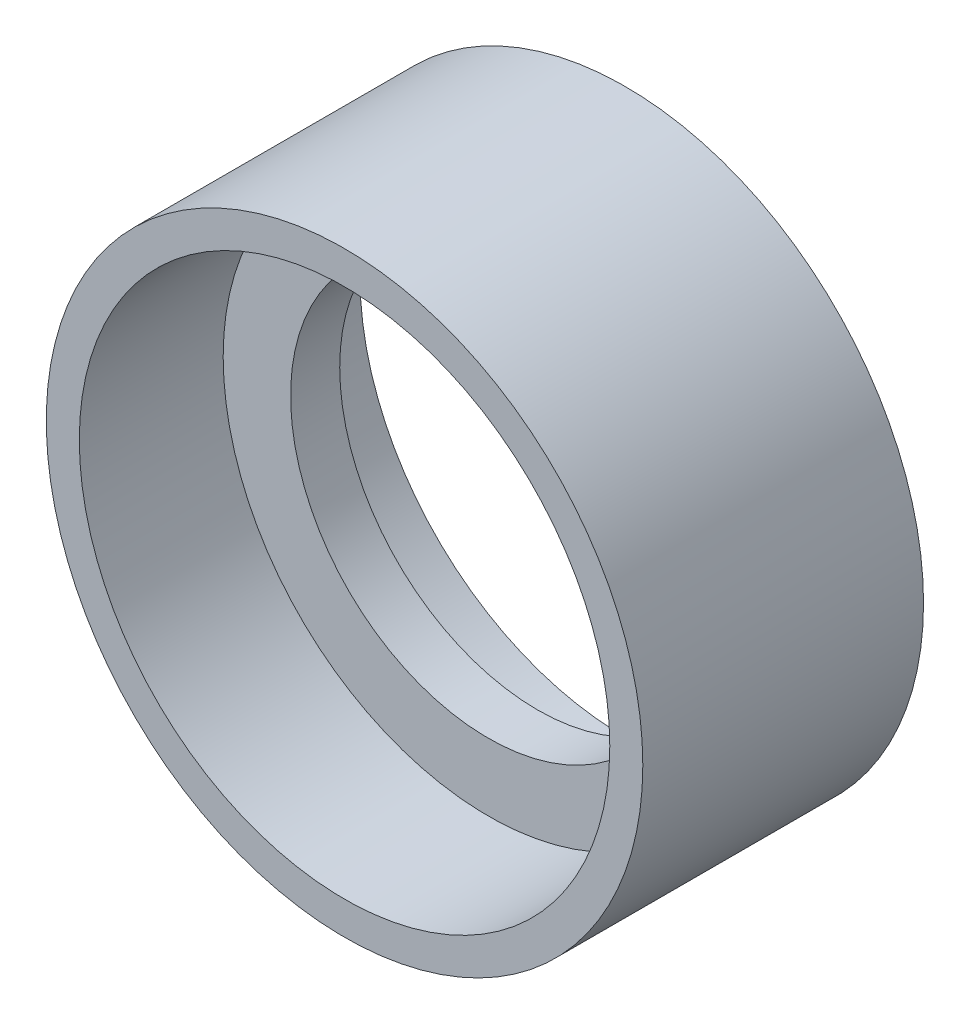
ISO-10303-21;
HEADER;
FILE_DESCRIPTION(('STEP AP214'),'2;1');
FILE_NAME('part.step','',(''),(''),'','','');
FILE_SCHEMA(('AUTOMOTIVE_DESIGN { 1 0 10303 214 1 1 1 1 }'));
ENDSEC;
DATA;
#1=APPLICATION_CONTEXT('core data for automotive mechanical design processes');
#2=APPLICATION_PROTOCOL_DEFINITION('international standard','automotive_design',2000,#1);
#3=PRODUCT_CONTEXT('',#1,'mechanical');
#4=PRODUCT('Part','Part','',(#3));
#5=PRODUCT_RELATED_PRODUCT_CATEGORY('part','',(#4));
#6=PRODUCT_DEFINITION_FORMATION('','',#4);
#7=PRODUCT_DEFINITION_CONTEXT('part definition',#1,'design');
#8=PRODUCT_DEFINITION('design','',#6,#7);
#9=PRODUCT_DEFINITION_SHAPE('','',#8);
#10=(LENGTH_UNIT() NAMED_UNIT(*) SI_UNIT(.MILLI.,.METRE.));
#11=(NAMED_UNIT(*) PLANE_ANGLE_UNIT() SI_UNIT($,.RADIAN.));
#12=(NAMED_UNIT(*) SI_UNIT($,.STERADIAN.) SOLID_ANGLE_UNIT());
#13=UNCERTAINTY_MEASURE_WITH_UNIT(LENGTH_MEASURE(1.E-05),#10,'distance_accuracy_value','');
#14=(GEOMETRIC_REPRESENTATION_CONTEXT(3) GLOBAL_UNCERTAINTY_ASSIGNED_CONTEXT((#13)) GLOBAL_UNIT_ASSIGNED_CONTEXT((#10,
#11,#12)) REPRESENTATION_CONTEXT('',''));
#15=CARTESIAN_POINT('',(0.,0.,0.));
#16=DIRECTION('',(0.,0.,1.));
#17=DIRECTION('',(1.,0.,0.));
#18=AXIS2_PLACEMENT_3D('',#15,#16,#17);
#19=CARTESIAN_POINT('',(0.,0.,12.7));
#20=DIRECTION('',(0.,0.,-1.));
#21=DIRECTION('',(-1.,0.,0.));
#22=AXIS2_PLACEMENT_3D('',#19,#20,#21);
#23=CYLINDRICAL_SURFACE('',#22,12.);
#24=CARTESIAN_POINT('',(0.,0.,12.7));
#25=DIRECTION('',(0.,0.,-1.));
#26=DIRECTION('',(-1.,0.,0.));
#27=AXIS2_PLACEMENT_3D('',#24,#25,#26);
#28=CIRCLE('',#27,12.);
#29=CARTESIAN_POINT('',(-12.,0.,12.7));
#30=VERTEX_POINT('',#29);
#31=EDGE_CURVE('E51',#30,#30,#28,.T.);
#32=ORIENTED_EDGE('',*,*,#31,.F.);
#33=EDGE_LOOP('',(#32));
#34=FACE_BOUND('',#33,.T.);
#35=CARTESIAN_POINT('',(0.,0.,6.19125));
#36=DIRECTION('',(0.,0.,-1.));
#37=DIRECTION('',(-1.,0.,0.));
#38=AXIS2_PLACEMENT_3D('',#35,#36,#37);
#39=CIRCLE('',#38,12.);
#40=CARTESIAN_POINT('',(-12.,0.,6.19125));
#41=VERTEX_POINT('',#40);
#42=EDGE_CURVE('E10',#41,#41,#39,.F.);
#43=ORIENTED_EDGE('',*,*,#42,.F.);
#44=EDGE_LOOP('',(#43));
#45=FACE_BOUND('',#44,.T.);
#46=ADVANCED_FACE('F35',(#34,#45),#23,.F.);
#47=CARTESIAN_POINT('',(0.,0.,12.7));
#48=DIRECTION('',(0.,0.,-1.));
#49=DIRECTION('',(-1.,0.,0.));
#50=AXIS2_PLACEMENT_3D('',#47,#48,#49);
#51=CYLINDRICAL_SURFACE('',#50,13.49375);
#52=CARTESIAN_POINT('',(0.,0.,12.7));
#53=DIRECTION('',(0.,0.,1.));
#54=DIRECTION('',(1.,0.,0.));
#55=AXIS2_PLACEMENT_3D('',#52,#53,#54);
#56=CIRCLE('',#55,13.49375);
#57=CARTESIAN_POINT('',(13.49375,0.,12.7));
#58=VERTEX_POINT('',#57);
#59=EDGE_CURVE('E43',#58,#58,#56,.T.);
#60=ORIENTED_EDGE('',*,*,#59,.F.);
#61=EDGE_LOOP('',(#60));
#62=FACE_BOUND('',#61,.T.);
#63=CARTESIAN_POINT('',(0.,0.,0.));
#64=DIRECTION('',(0.,0.,1.));
#65=DIRECTION('',(1.,0.,0.));
#66=AXIS2_PLACEMENT_3D('',#63,#64,#65);
#67=CIRCLE('',#66,13.49375);
#68=CARTESIAN_POINT('',(13.49375,0.,0.));
#69=VERTEX_POINT('',#68);
#70=EDGE_CURVE('E47',#69,#69,#67,.T.);
#71=ORIENTED_EDGE('',*,*,#70,.T.);
#72=EDGE_LOOP('',(#71));
#73=FACE_BOUND('',#72,.T.);
#74=ADVANCED_FACE('F37',(#62,#73),#51,.T.);
#75=CARTESIAN_POINT('',(0.,0.,12.7));
#76=DIRECTION('',(0.,0.,1.));
#77=DIRECTION('',(1.,0.,0.));
#78=AXIS2_PLACEMENT_3D('',#75,#76,#77);
#79=PLANE('',#78);
#80=ORIENTED_EDGE('',*,*,#31,.T.);
#81=EDGE_LOOP('',(#80));
#82=FACE_BOUND('',#81,.T.);
#83=ORIENTED_EDGE('',*,*,#59,.T.);
#84=EDGE_LOOP('',(#83));
#85=FACE_BOUND('',#84,.T.);
#86=ADVANCED_FACE('F86',(#82,#85),#79,.T.);
#87=CARTESIAN_POINT('',(0.,0.,0.));
#88=DIRECTION('',(0.,0.,1.));
#89=DIRECTION('',(1.,0.,0.));
#90=AXIS2_PLACEMENT_3D('',#87,#88,#89);
#91=PLANE('',#90);
#92=CARTESIAN_POINT('',(0.,0.,0.));
#93=DIRECTION('',(0.,0.,-1.));
#94=DIRECTION('',(-1.,0.,0.));
#95=AXIS2_PLACEMENT_3D('',#92,#93,#94);
#96=CIRCLE('',#95,12.);
#97=CARTESIAN_POINT('',(-12.,0.,0.));
#98=VERTEX_POINT('',#97);
#99=EDGE_CURVE('E53',#98,#98,#96,.T.);
#100=ORIENTED_EDGE('',*,*,#99,.F.);
#101=EDGE_LOOP('',(#100));
#102=FACE_BOUND('',#101,.T.);
#103=ORIENTED_EDGE('',*,*,#70,.F.);
#104=EDGE_LOOP('',(#103));
#105=FACE_BOUND('',#104,.T.);
#106=ADVANCED_FACE('F80',(#102,#105),#91,.F.);
#107=CARTESIAN_POINT('',(0.,0.,3.96875));
#108=DIRECTION('',(0.,0.,-1.));
#109=DIRECTION('',(-1.,0.,0.));
#110=AXIS2_PLACEMENT_3D('',#107,#108,#109);
#111=CIRCLE('',#110,12.);
#112=CARTESIAN_POINT('',(-12.,0.,3.96875));
#113=VERTEX_POINT('',#112);
#114=EDGE_CURVE('E56',#113,#113,#111,.T.);
#115=ORIENTED_EDGE('',*,*,#114,.F.);
#116=EDGE_LOOP('',(#115));
#117=FACE_BOUND('',#116,.T.);
#118=ORIENTED_EDGE('',*,*,#99,.T.);
#119=EDGE_LOOP('',(#118));
#120=FACE_BOUND('',#119,.T.);
#121=ADVANCED_FACE('F74',(#117,#120),#23,.F.);
#122=CARTESIAN_POINT('',(0.,0.,3.96875));
#123=DIRECTION('',(0.,0.,-1.));
#124=DIRECTION('',(-1.,0.,0.));
#125=AXIS2_PLACEMENT_3D('',#122,#123,#124);
#126=PLANE('',#125);
#127=CARTESIAN_POINT('',(0.,0.,3.96875));
#128=DIRECTION('',(0.,0.,-1.));
#129=DIRECTION('',(-1.,0.,0.));
#130=AXIS2_PLACEMENT_3D('',#127,#128,#129);
#131=CIRCLE('',#130,8.95);
#132=CARTESIAN_POINT('',(-8.95,0.,3.96875));
#133=VERTEX_POINT('',#132);
#134=EDGE_CURVE('E39',#133,#133,#131,.T.);
#135=ORIENTED_EDGE('',*,*,#134,.F.);
#136=EDGE_LOOP('',(#135));
#137=FACE_BOUND('',#136,.T.);
#138=ORIENTED_EDGE('',*,*,#114,.T.);
#139=EDGE_LOOP('',(#138));
#140=FACE_BOUND('',#139,.T.);
#141=ADVANCED_FACE('F70',(#137,#140),#126,.T.);
#142=CARTESIAN_POINT('',(0.,0.,6.19125));
#143=DIRECTION('',(0.,0.,-1.));
#144=DIRECTION('',(-1.,0.,0.));
#145=AXIS2_PLACEMENT_3D('',#142,#143,#144);
#146=PLANE('',#145);
#147=CARTESIAN_POINT('',(0.,0.,6.19125));
#148=DIRECTION('',(0.,0.,1.));
#149=DIRECTION('',(1.,0.,0.));
#150=AXIS2_PLACEMENT_3D('',#147,#148,#149);
#151=CIRCLE('',#150,8.95);
#152=CARTESIAN_POINT('',(8.95,0.,6.19125));
#153=VERTEX_POINT('',#152);
#154=EDGE_CURVE('E61',#153,#153,#151,.T.);
#155=ORIENTED_EDGE('',*,*,#154,.F.);
#156=EDGE_LOOP('',(#155));
#157=FACE_BOUND('',#156,.T.);
#158=ORIENTED_EDGE('',*,*,#42,.T.);
#159=EDGE_LOOP('',(#158));
#160=FACE_BOUND('',#159,.T.);
#161=ADVANCED_FACE('F73',(#157,#160),#146,.F.);
#162=CARTESIAN_POINT('',(0.,0.,0.));
#163=DIRECTION('',(0.,0.,1.));
#164=DIRECTION('',(1.,0.,0.));
#165=AXIS2_PLACEMENT_3D('',#162,#163,#164);
#166=CYLINDRICAL_SURFACE('',#165,8.95);
#167=ORIENTED_EDGE('',*,*,#134,.T.);
#168=EDGE_LOOP('',(#167));
#169=FACE_BOUND('',#168,.T.);
#170=ORIENTED_EDGE('',*,*,#154,.T.);
#171=EDGE_LOOP('',(#170));
#172=FACE_BOUND('',#171,.T.);
#173=ADVANCED_FACE('F68',(#169,#172),#166,.F.);
#174=CLOSED_SHELL('',(#46,#74,#86,#106,#121,#141,#161,#173));
#175=MANIFOLD_SOLID_BREP('B2',#174);
#176=ADVANCED_BREP_SHAPE_REPRESENTATION('',(#18,#175),#14);
#177=SHAPE_DEFINITION_REPRESENTATION(#9,#176);
ENDSEC;
END-ISO-10303-21;
